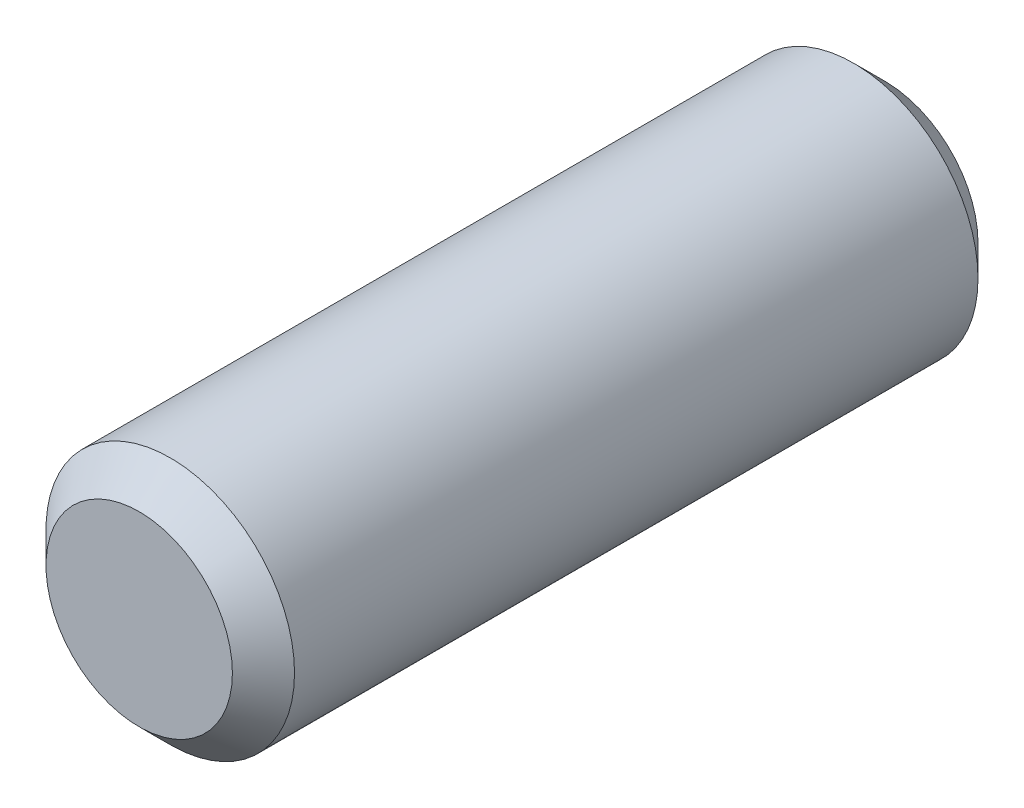
ISO-10303-21;
HEADER;
FILE_DESCRIPTION(('STEP AP214'),'2;1');
FILE_NAME('part.step','',(''),(''),'','','');
FILE_SCHEMA(('AUTOMOTIVE_DESIGN { 1 0 10303 214 1 1 1 1 }'));
ENDSEC;
DATA;
#1=APPLICATION_CONTEXT('core data for automotive mechanical design processes');
#2=APPLICATION_PROTOCOL_DEFINITION('international standard','automotive_design',2000,#1);
#3=PRODUCT_CONTEXT('',#1,'mechanical');
#4=PRODUCT('Part','Part','',(#3));
#5=PRODUCT_RELATED_PRODUCT_CATEGORY('part','',(#4));
#6=PRODUCT_DEFINITION_FORMATION('','',#4);
#7=PRODUCT_DEFINITION_CONTEXT('part definition',#1,'design');
#8=PRODUCT_DEFINITION('design','',#6,#7);
#9=PRODUCT_DEFINITION_SHAPE('','',#8);
#10=(LENGTH_UNIT() NAMED_UNIT(*) SI_UNIT(.MILLI.,.METRE.));
#11=(NAMED_UNIT(*) PLANE_ANGLE_UNIT() SI_UNIT($,.RADIAN.));
#12=(NAMED_UNIT(*) SI_UNIT($,.STERADIAN.) SOLID_ANGLE_UNIT());
#13=UNCERTAINTY_MEASURE_WITH_UNIT(LENGTH_MEASURE(1.E-05),#10,'distance_accuracy_value','');
#14=(GEOMETRIC_REPRESENTATION_CONTEXT(3) GLOBAL_UNCERTAINTY_ASSIGNED_CONTEXT((#13)) GLOBAL_UNIT_ASSIGNED_CONTEXT((#10,
#11,#12)) REPRESENTATION_CONTEXT('',''));
#15=CARTESIAN_POINT('',(0.,0.,0.));
#16=DIRECTION('',(0.,0.,1.));
#17=DIRECTION('',(1.,0.,0.));
#18=AXIS2_PLACEMENT_3D('',#15,#16,#17);
#19=CARTESIAN_POINT('',(0.,0.,3.));
#20=DIRECTION('',(0.,0.,-1.));
#21=DIRECTION('',(-1.,0.,0.));
#22=AXIS2_PLACEMENT_3D('',#19,#20,#21);
#23=CYLINDRICAL_SURFACE('',#22,1.);
#24=CARTESIAN_POINT('',(0.,0.,-2.75));
#25=DIRECTION('',(0.,0.,1.));
#26=DIRECTION('',(1.,0.,0.));
#27=AXIS2_PLACEMENT_3D('',#24,#25,#26);
#28=CIRCLE('',#27,1.);
#29=CARTESIAN_POINT('',(1.,0.,-2.75));
#30=VERTEX_POINT('',#29);
#31=EDGE_CURVE('E53',#30,#30,#28,.T.);
#32=ORIENTED_EDGE('',*,*,#31,.T.);
#33=EDGE_LOOP('',(#32));
#34=FACE_BOUND('',#33,.T.);
#35=CARTESIAN_POINT('',(0.,0.,2.75));
#36=DIRECTION('',(0.,0.,1.));
#37=DIRECTION('',(1.,0.,0.));
#38=AXIS2_PLACEMENT_3D('',#35,#36,#37);
#39=CIRCLE('',#38,1.);
#40=CARTESIAN_POINT('',(1.,0.,2.75));
#41=VERTEX_POINT('',#40);
#42=EDGE_CURVE('E58',#41,#41,#39,.F.);
#43=ORIENTED_EDGE('',*,*,#42,.T.);
#44=EDGE_LOOP('',(#43));
#45=FACE_BOUND('',#44,.T.);
#46=ADVANCED_FACE('F39',(#34,#45),#23,.T.);
#47=CARTESIAN_POINT('',(0.,0.,3.));
#48=DIRECTION('',(0.,0.,1.));
#49=DIRECTION('',(1.,0.,0.));
#50=AXIS2_PLACEMENT_3D('',#47,#48,#49);
#51=PLANE('',#50);
#52=CARTESIAN_POINT('',(0.,0.,3.));
#53=DIRECTION('',(0.,0.,1.));
#54=DIRECTION('',(1.,0.,0.));
#55=AXIS2_PLACEMENT_3D('',#52,#53,#54);
#56=CIRCLE('',#55,0.749999999999999);
#57=CARTESIAN_POINT('',(0.749999999999999,0.,3.));
#58=VERTEX_POINT('',#57);
#59=EDGE_CURVE('E10',#58,#58,#56,.T.);
#60=ORIENTED_EDGE('',*,*,#59,.T.);
#61=EDGE_LOOP('',(#60));
#62=FACE_BOUND('',#61,.T.);
#63=ADVANCED_FACE('F75',(#62),#51,.T.);
#64=CARTESIAN_POINT('',(0.,0.,-3.));
#65=DIRECTION('',(0.,0.,1.));
#66=DIRECTION('',(1.,0.,0.));
#67=AXIS2_PLACEMENT_3D('',#64,#65,#66);
#68=PLANE('',#67);
#69=CARTESIAN_POINT('',(0.,0.,-3.));
#70=DIRECTION('',(0.,0.,1.));
#71=DIRECTION('',(1.,0.,0.));
#72=AXIS2_PLACEMENT_3D('',#69,#70,#71);
#73=CIRCLE('',#72,0.75);
#74=CARTESIAN_POINT('',(0.75,0.,-3.));
#75=VERTEX_POINT('',#74);
#76=EDGE_CURVE('E48',#75,#75,#73,.F.);
#77=ORIENTED_EDGE('',*,*,#76,.T.);
#78=EDGE_LOOP('',(#77));
#79=FACE_BOUND('',#78,.T.);
#80=ADVANCED_FACE('F72',(#79),#68,.F.);
#81=CARTESIAN_POINT('',(0.,0.,-2.75));
#82=DIRECTION('',(0.,0.,1.));
#83=DIRECTION('',(1.,0.,0.));
#84=AXIS2_PLACEMENT_3D('',#81,#82,#83);
#85=CONICAL_SURFACE('',#84,1.,0.785398163397452);
#86=ORIENTED_EDGE('',*,*,#76,.F.);
#87=EDGE_LOOP('',(#86));
#88=FACE_BOUND('',#87,.T.);
#89=ORIENTED_EDGE('',*,*,#31,.F.);
#90=EDGE_LOOP('',(#89));
#91=FACE_BOUND('',#90,.T.);
#92=ADVANCED_FACE('F68',(#88,#91),#85,.T.);
#93=CARTESIAN_POINT('',(0.,0.,3.));
#94=DIRECTION('',(0.,0.,-1.));
#95=DIRECTION('',(-1.,0.,0.));
#96=AXIS2_PLACEMENT_3D('',#93,#94,#95);
#97=CONICAL_SURFACE('',#96,0.749999999999999,0.785398163397447);
#98=ORIENTED_EDGE('',*,*,#42,.F.);
#99=EDGE_LOOP('',(#98));
#100=FACE_BOUND('',#99,.T.);
#101=ORIENTED_EDGE('',*,*,#59,.F.);
#102=EDGE_LOOP('',(#101));
#103=FACE_BOUND('',#102,.T.);
#104=ADVANCED_FACE('F42',(#100,#103),#97,.T.);
#105=CLOSED_SHELL('',(#46,#63,#80,#92,#104));
#106=MANIFOLD_SOLID_BREP('B2',#105);
#107=ADVANCED_BREP_SHAPE_REPRESENTATION('',(#18,#106),#14);
#108=SHAPE_DEFINITION_REPRESENTATION(#9,#107);
ENDSEC;
END-ISO-10303-21;
